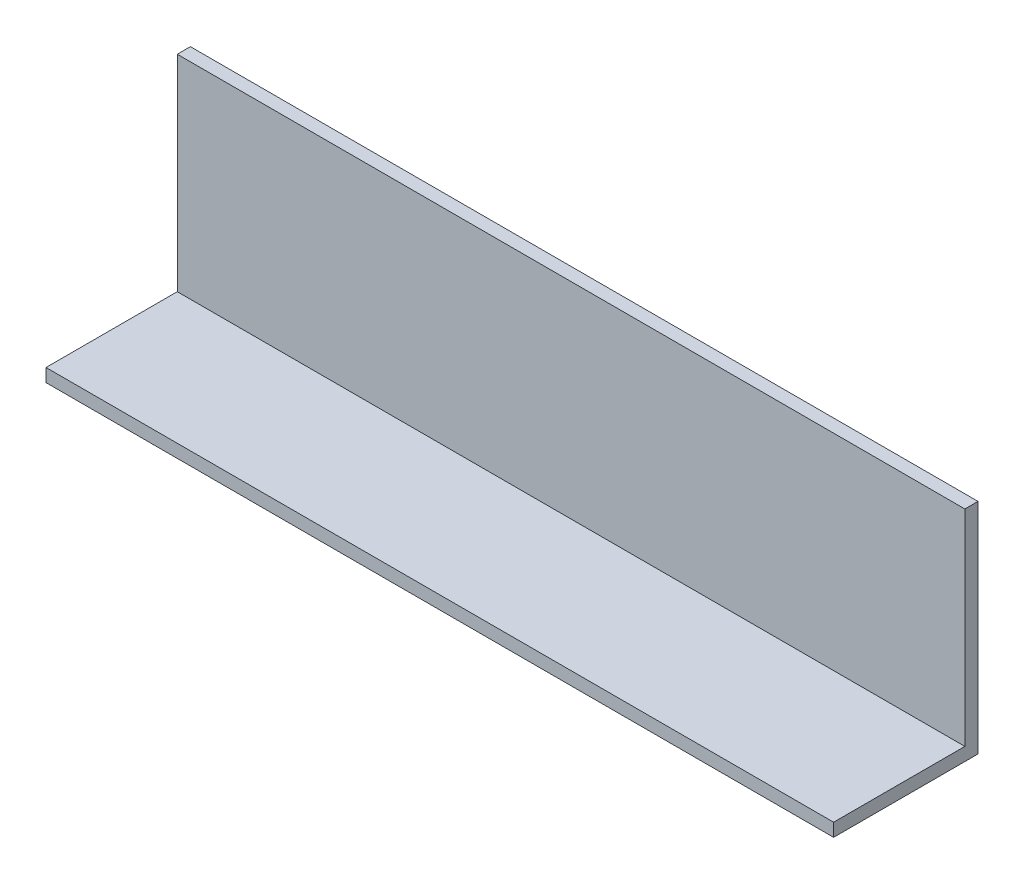
ISO-10303-21;
HEADER;
FILE_DESCRIPTION(('STEP AP214'),'2;1');
FILE_NAME('part.step','',(''),(''),'','','');
FILE_SCHEMA(('AUTOMOTIVE_DESIGN { 1 0 10303 214 1 1 1 1 }'));
ENDSEC;
DATA;
#1=APPLICATION_CONTEXT('core data for automotive mechanical design processes');
#2=APPLICATION_PROTOCOL_DEFINITION('international standard','automotive_design',2000,#1);
#3=PRODUCT_CONTEXT('',#1,'mechanical');
#4=PRODUCT('Part','Part','',(#3));
#5=PRODUCT_RELATED_PRODUCT_CATEGORY('part','',(#4));
#6=PRODUCT_DEFINITION_FORMATION('','',#4);
#7=PRODUCT_DEFINITION_CONTEXT('part definition',#1,'design');
#8=PRODUCT_DEFINITION('design','',#6,#7);
#9=PRODUCT_DEFINITION_SHAPE('','',#8);
#10=(LENGTH_UNIT() NAMED_UNIT(*) SI_UNIT(.MILLI.,.METRE.));
#11=(NAMED_UNIT(*) PLANE_ANGLE_UNIT() SI_UNIT($,.RADIAN.));
#12=(NAMED_UNIT(*) SI_UNIT($,.STERADIAN.) SOLID_ANGLE_UNIT());
#13=UNCERTAINTY_MEASURE_WITH_UNIT(LENGTH_MEASURE(1.E-05),#10,'distance_accuracy_value','');
#14=(GEOMETRIC_REPRESENTATION_CONTEXT(3) GLOBAL_UNCERTAINTY_ASSIGNED_CONTEXT((#13)) GLOBAL_UNIT_ASSIGNED_CONTEXT((#10,
#11,#12)) REPRESENTATION_CONTEXT('',''));
#15=CARTESIAN_POINT('',(0.,0.,0.));
#16=DIRECTION('',(0.,0.,1.));
#17=DIRECTION('',(1.,0.,0.));
#18=AXIS2_PLACEMENT_3D('',#15,#16,#17);
#19=CARTESIAN_POINT('',(900.,250.,30.));
#20=DIRECTION('',(-1.,0.,0.));
#21=DIRECTION('',(0.,0.,1.));
#22=AXIS2_PLACEMENT_3D('',#19,#20,#21);
#23=PLANE('',#22);
#24=DIRECTION('',(0.,1.,0.));
#25=VECTOR('',#24,1.);
#26=CARTESIAN_POINT('',(900.,250.,0.));
#27=LINE('',#26,#25);
#28=CARTESIAN_POINT('',(900.,-250.,0.));
#29=VERTEX_POINT('',#28);
#30=CARTESIAN_POINT('',(900.,250.,0.));
#31=VERTEX_POINT('',#30);
#32=EDGE_CURVE('E106',#29,#31,#27,.T.);
#33=ORIENTED_EDGE('',*,*,#32,.T.);
#34=DIRECTION('',(0.,0.,-1.));
#35=VECTOR('',#34,1.);
#36=CARTESIAN_POINT('',(900.,250.,30.));
#37=LINE('',#36,#35);
#38=CARTESIAN_POINT('',(900.,250.,30.));
#39=VERTEX_POINT('',#38);
#40=EDGE_CURVE('E11',#39,#31,#37,.T.);
#41=ORIENTED_EDGE('',*,*,#40,.F.);
#42=DIRECTION('',(0.,1.,0.));
#43=VECTOR('',#42,1.);
#44=CARTESIAN_POINT('',(900.,250.,30.));
#45=LINE('',#44,#43);
#46=CARTESIAN_POINT('',(900.,-220.,30.));
#47=VERTEX_POINT('',#46);
#48=EDGE_CURVE('E99',#47,#39,#45,.T.);
#49=ORIENTED_EDGE('',*,*,#48,.F.);
#50=DIRECTION('',(0.,0.,-1.));
#51=VECTOR('',#50,1.);
#52=CARTESIAN_POINT('',(900.,-220.,330.));
#53=LINE('',#52,#51);
#54=CARTESIAN_POINT('',(900.,-220.,330.));
#55=VERTEX_POINT('',#54);
#56=EDGE_CURVE('E116',#55,#47,#53,.T.);
#57=ORIENTED_EDGE('',*,*,#56,.F.);
#58=DIRECTION('',(0.,1.,0.));
#59=VECTOR('',#58,1.);
#60=CARTESIAN_POINT('',(900.,-250.,330.));
#61=LINE('',#60,#59);
#62=CARTESIAN_POINT('',(900.,-250.,330.));
#63=VERTEX_POINT('',#62);
#64=EDGE_CURVE('E109',#63,#55,#61,.T.);
#65=ORIENTED_EDGE('',*,*,#64,.F.);
#66=DIRECTION('',(0.,0.,-1.));
#67=VECTOR('',#66,1.);
#68=CARTESIAN_POINT('',(900.,-250.,30.));
#69=LINE('',#68,#67);
#70=EDGE_CURVE('E91',#63,#29,#69,.T.);
#71=ORIENTED_EDGE('',*,*,#70,.T.);
#72=EDGE_LOOP('',(#33,#41,#49,#57,#65,#71));
#73=FACE_BOUND('',#72,.T.);
#74=ADVANCED_FACE('F45',(#73),#23,.F.);
#75=CARTESIAN_POINT('',(-900.,250.,30.));
#76=DIRECTION('',(0.,-1.,0.));
#77=DIRECTION('',(0.,0.,-1.));
#78=AXIS2_PLACEMENT_3D('',#75,#76,#77);
#79=PLANE('',#78);
#80=DIRECTION('',(-1.,0.,0.));
#81=VECTOR('',#80,1.);
#82=CARTESIAN_POINT('',(-900.,250.,0.));
#83=LINE('',#82,#81);
#84=CARTESIAN_POINT('',(-900.,250.,0.));
#85=VERTEX_POINT('',#84);
#86=EDGE_CURVE('E114',#31,#85,#83,.T.);
#87=ORIENTED_EDGE('',*,*,#86,.T.);
#88=DIRECTION('',(0.,0.,-1.));
#89=VECTOR('',#88,1.);
#90=CARTESIAN_POINT('',(-900.,250.,30.));
#91=LINE('',#90,#89);
#92=CARTESIAN_POINT('',(-900.,250.,30.));
#93=VERTEX_POINT('',#92);
#94=EDGE_CURVE('E53',#93,#85,#91,.T.);
#95=ORIENTED_EDGE('',*,*,#94,.F.);
#96=DIRECTION('',(-1.,0.,0.));
#97=VECTOR('',#96,1.);
#98=CARTESIAN_POINT('',(-900.,250.,30.));
#99=LINE('',#98,#97);
#100=EDGE_CURVE('E66',#39,#93,#99,.T.);
#101=ORIENTED_EDGE('',*,*,#100,.F.);
#102=ORIENTED_EDGE('',*,*,#40,.T.);
#103=EDGE_LOOP('',(#87,#95,#101,#102));
#104=FACE_BOUND('',#103,.T.);
#105=ADVANCED_FACE('F137',(#104),#79,.F.);
#106=CARTESIAN_POINT('',(-900.,250.,30.));
#107=DIRECTION('',(1.,0.,0.));
#108=DIRECTION('',(0.,1.,0.));
#109=AXIS2_PLACEMENT_3D('',#106,#107,#108);
#110=PLANE('',#109);
#111=DIRECTION('',(0.,-1.,0.));
#112=VECTOR('',#111,1.);
#113=CARTESIAN_POINT('',(-900.,250.,0.));
#114=LINE('',#113,#112);
#115=CARTESIAN_POINT('',(-900.,-250.,0.));
#116=VERTEX_POINT('',#115);
#117=EDGE_CURVE('E100',#85,#116,#114,.T.);
#118=ORIENTED_EDGE('',*,*,#117,.T.);
#119=DIRECTION('',(0.,0.,-1.));
#120=VECTOR('',#119,1.);
#121=CARTESIAN_POINT('',(-900.,-250.,30.));
#122=LINE('',#121,#120);
#123=CARTESIAN_POINT('',(-900.,-250.,330.));
#124=VERTEX_POINT('',#123);
#125=EDGE_CURVE('E94',#124,#116,#122,.T.);
#126=ORIENTED_EDGE('',*,*,#125,.F.);
#127=DIRECTION('',(0.,-1.,0.));
#128=VECTOR('',#127,1.);
#129=CARTESIAN_POINT('',(-900.,-250.,330.));
#130=LINE('',#129,#128);
#131=CARTESIAN_POINT('',(-900.,-220.,330.));
#132=VERTEX_POINT('',#131);
#133=EDGE_CURVE('E162',#132,#124,#130,.T.);
#134=ORIENTED_EDGE('',*,*,#133,.F.);
#135=DIRECTION('',(0.,0.,-1.));
#136=VECTOR('',#135,1.);
#137=CARTESIAN_POINT('',(-900.,-220.,330.));
#138=LINE('',#137,#136);
#139=CARTESIAN_POINT('',(-900.,-220.,30.));
#140=VERTEX_POINT('',#139);
#141=EDGE_CURVE('E122',#132,#140,#138,.T.);
#142=ORIENTED_EDGE('',*,*,#141,.T.);
#143=DIRECTION('',(0.,-1.,0.));
#144=VECTOR('',#143,1.);
#145=CARTESIAN_POINT('',(-900.,250.,30.));
#146=LINE('',#145,#144);
#147=EDGE_CURVE('E111',#93,#140,#146,.T.);
#148=ORIENTED_EDGE('',*,*,#147,.F.);
#149=ORIENTED_EDGE('',*,*,#94,.T.);
#150=EDGE_LOOP('',(#118,#126,#134,#142,#148,#149));
#151=FACE_BOUND('',#150,.T.);
#152=ADVANCED_FACE('F134',(#151),#110,.F.);
#153=CARTESIAN_POINT('',(-900.,-250.,30.));
#154=DIRECTION('',(0.,1.,0.));
#155=DIRECTION('',(0.,0.,1.));
#156=AXIS2_PLACEMENT_3D('',#153,#154,#155);
#157=PLANE('',#156);
#158=DIRECTION('',(1.,0.,0.));
#159=VECTOR('',#158,1.);
#160=CARTESIAN_POINT('',(-900.,-250.,0.));
#161=LINE('',#160,#159);
#162=EDGE_CURVE('E86',#116,#29,#161,.T.);
#163=ORIENTED_EDGE('',*,*,#162,.T.);
#164=ORIENTED_EDGE('',*,*,#70,.F.);
#165=DIRECTION('',(1.,0.,0.));
#166=VECTOR('',#165,1.);
#167=CARTESIAN_POINT('',(-900.,-250.,330.));
#168=LINE('',#167,#166);
#169=EDGE_CURVE('E157',#124,#63,#168,.T.);
#170=ORIENTED_EDGE('',*,*,#169,.F.);
#171=ORIENTED_EDGE('',*,*,#125,.T.);
#172=EDGE_LOOP('',(#163,#164,#170,#171));
#173=FACE_BOUND('',#172,.T.);
#174=ADVANCED_FACE('F88',(#173),#157,.F.);
#175=CARTESIAN_POINT('',(0.,0.,30.));
#176=DIRECTION('',(0.,0.,1.));
#177=DIRECTION('',(1.,0.,0.));
#178=AXIS2_PLACEMENT_3D('',#175,#176,#177);
#179=PLANE('',#178);
#180=DIRECTION('',(-1.,0.,0.));
#181=VECTOR('',#180,1.);
#182=CARTESIAN_POINT('',(-900.,-220.,30.));
#183=LINE('',#182,#181);
#184=EDGE_CURVE('E60',#47,#140,#183,.T.);
#185=ORIENTED_EDGE('',*,*,#184,.F.);
#186=ORIENTED_EDGE('',*,*,#48,.T.);
#187=ORIENTED_EDGE('',*,*,#100,.T.);
#188=ORIENTED_EDGE('',*,*,#147,.T.);
#189=EDGE_LOOP('',(#185,#186,#187,#188));
#190=FACE_BOUND('',#189,.T.);
#191=ADVANCED_FACE('F165',(#190),#179,.T.);
#192=CARTESIAN_POINT('',(0.,0.,0.));
#193=DIRECTION('',(0.,0.,1.));
#194=DIRECTION('',(1.,0.,0.));
#195=AXIS2_PLACEMENT_3D('',#192,#193,#194);
#196=PLANE('',#195);
#197=ORIENTED_EDGE('',*,*,#32,.F.);
#198=ORIENTED_EDGE('',*,*,#162,.F.);
#199=ORIENTED_EDGE('',*,*,#117,.F.);
#200=ORIENTED_EDGE('',*,*,#86,.F.);
#201=EDGE_LOOP('',(#197,#198,#199,#200));
#202=FACE_BOUND('',#201,.T.);
#203=ADVANCED_FACE('F113',(#202),#196,.F.);
#204=CARTESIAN_POINT('',(-900.,-220.,330.));
#205=DIRECTION('',(0.,-1.,0.));
#206=DIRECTION('',(0.,0.,-1.));
#207=AXIS2_PLACEMENT_3D('',#204,#205,#206);
#208=PLANE('',#207);
#209=ORIENTED_EDGE('',*,*,#184,.T.);
#210=ORIENTED_EDGE('',*,*,#141,.F.);
#211=DIRECTION('',(-1.,0.,0.));
#212=VECTOR('',#211,1.);
#213=CARTESIAN_POINT('',(-900.,-220.,330.));
#214=LINE('',#213,#212);
#215=EDGE_CURVE('E147',#55,#132,#214,.T.);
#216=ORIENTED_EDGE('',*,*,#215,.F.);
#217=ORIENTED_EDGE('',*,*,#56,.T.);
#218=EDGE_LOOP('',(#209,#210,#216,#217));
#219=FACE_BOUND('',#218,.T.);
#220=ADVANCED_FACE('F143',(#219),#208,.F.);
#221=CARTESIAN_POINT('',(0.,0.,330.));
#222=DIRECTION('',(0.,0.,-1.));
#223=DIRECTION('',(-1.,0.,0.));
#224=AXIS2_PLACEMENT_3D('',#221,#222,#223);
#225=PLANE('',#224);
#226=ORIENTED_EDGE('',*,*,#133,.T.);
#227=ORIENTED_EDGE('',*,*,#169,.T.);
#228=ORIENTED_EDGE('',*,*,#64,.T.);
#229=ORIENTED_EDGE('',*,*,#215,.T.);
#230=EDGE_LOOP('',(#226,#227,#228,#229));
#231=FACE_BOUND('',#230,.T.);
#232=ADVANCED_FACE('F171',(#231),#225,.F.);
#233=CLOSED_SHELL('',(#74,#105,#152,#174,#191,#203,#220,#232));
#234=MANIFOLD_SOLID_BREP('B2',#233);
#235=ADVANCED_BREP_SHAPE_REPRESENTATION('',(#18,#234),#14);
#236=SHAPE_DEFINITION_REPRESENTATION(#9,#235);
ENDSEC;
END-ISO-10303-21;
